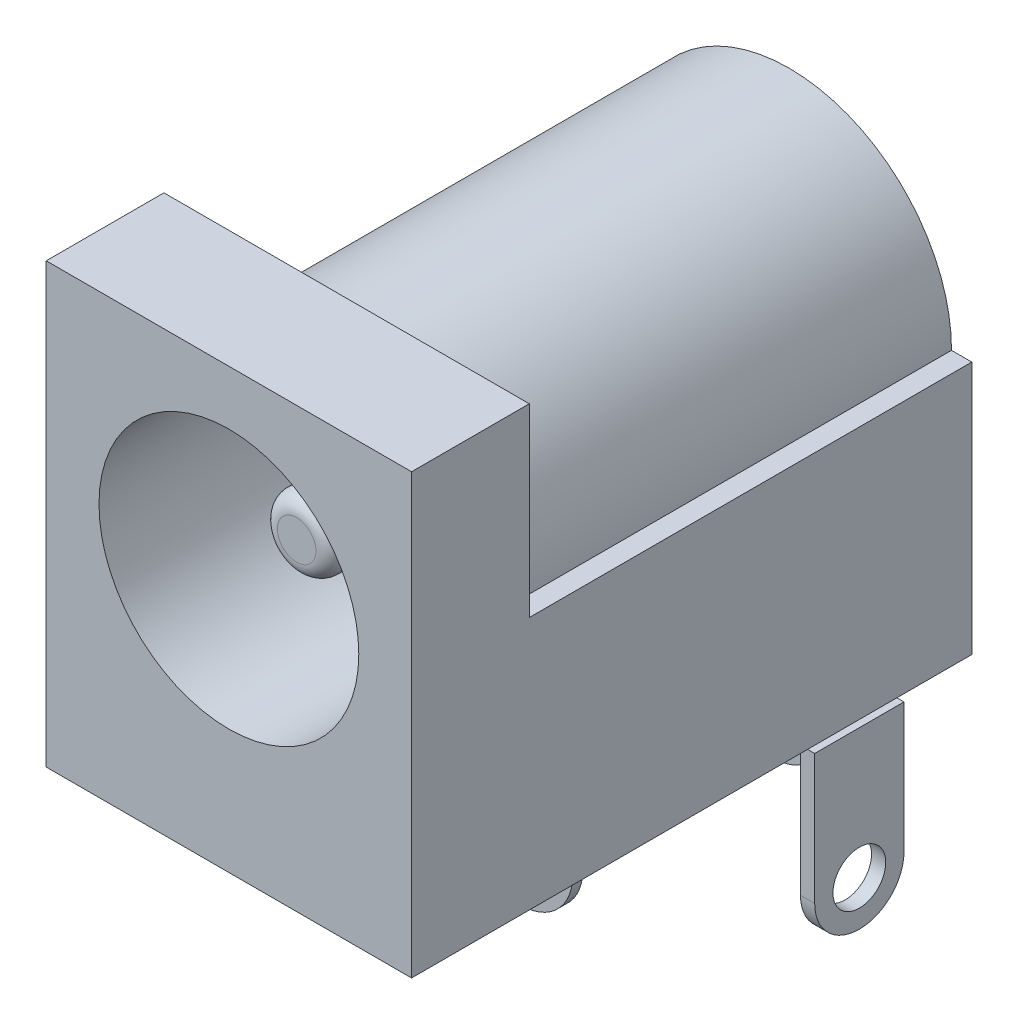
ISO-10303-21;
HEADER;
FILE_DESCRIPTION(('STEP AP214'),'2;1');
FILE_NAME('part.step','',(''),(''),'','','');
FILE_SCHEMA(('AUTOMOTIVE_DESIGN { 1 0 10303 214 1 1 1 1 }'));
ENDSEC;
DATA;
#1=APPLICATION_CONTEXT('core data for automotive mechanical design processes');
#2=APPLICATION_PROTOCOL_DEFINITION('international standard','automotive_design',2000,#1);
#3=PRODUCT_CONTEXT('',#1,'mechanical');
#4=PRODUCT('Part','Part','',(#3));
#5=PRODUCT_RELATED_PRODUCT_CATEGORY('part','',(#4));
#6=PRODUCT_DEFINITION_FORMATION('','',#4);
#7=PRODUCT_DEFINITION_CONTEXT('part definition',#1,'design');
#8=PRODUCT_DEFINITION('design','',#6,#7);
#9=PRODUCT_DEFINITION_SHAPE('','',#8);
#10=(LENGTH_UNIT() NAMED_UNIT(*) SI_UNIT(.MILLI.,.METRE.));
#11=(NAMED_UNIT(*) PLANE_ANGLE_UNIT() SI_UNIT($,.RADIAN.));
#12=(NAMED_UNIT(*) SI_UNIT($,.STERADIAN.) SOLID_ANGLE_UNIT());
#13=UNCERTAINTY_MEASURE_WITH_UNIT(LENGTH_MEASURE(1.E-05),#10,'distance_accuracy_value','');
#14=(GEOMETRIC_REPRESENTATION_CONTEXT(3) GLOBAL_UNCERTAINTY_ASSIGNED_CONTEXT((#13)) GLOBAL_UNIT_ASSIGNED_CONTEXT((#10,
#11,#12)) REPRESENTATION_CONTEXT('',''));
#15=CARTESIAN_POINT('',(0.,0.,0.));
#16=DIRECTION('',(0.,0.,1.));
#17=DIRECTION('',(1.,0.,0.));
#18=AXIS2_PLACEMENT_3D('',#15,#16,#17);
#19=CARTESIAN_POINT('',(5.65,-4.3,-10.905));
#20=DIRECTION('',(-1.,0.,0.));
#21=DIRECTION('',(0.,0.,1.));
#22=AXIS2_PLACEMENT_3D('',#19,#20,#21);
#23=PLANE('',#22);
#24=DIRECTION('',(0.,0.,1.));
#25=VECTOR('',#24,1.);
#26=CARTESIAN_POINT('',(5.65,-3.15,2.901));
#27=LINE('',#26,#25);
#28=CARTESIAN_POINT('',(5.65,-3.15,-10.905));
#29=VERTEX_POINT('',#28);
#30=CARTESIAN_POINT('',(5.65,-3.15,-10.555));
#31=VERTEX_POINT('',#30);
#32=EDGE_CURVE('E203',#29,#31,#27,.T.);
#33=ORIENTED_EDGE('',*,*,#32,.F.);
#34=DIRECTION('',(0.,1.,0.));
#35=VECTOR('',#34,1.);
#36=CARTESIAN_POINT('',(5.65,-4.3,-10.905));
#37=LINE('',#36,#35);
#38=CARTESIAN_POINT('',(5.65,0.,-10.905));
#39=VERTEX_POINT('',#38);
#40=EDGE_CURVE('E448',#29,#39,#37,.T.);
#41=ORIENTED_EDGE('',*,*,#40,.T.);
#42=DIRECTION('',(0.,0.,1.));
#43=VECTOR('',#42,1.);
#44=CARTESIAN_POINT('',(5.65,0.,-10.905));
#45=LINE('',#44,#43);
#46=CARTESIAN_POINT('',(5.65,0.,-10.9));
#47=VERTEX_POINT('',#46);
#48=EDGE_CURVE('E434',#39,#47,#45,.T.);
#49=ORIENTED_EDGE('',*,*,#48,.T.);
#50=CARTESIAN_POINT('',(5.65,0.,-10.555));
#51=VERTEX_POINT('',#50);
#52=EDGE_CURVE('E211',#47,#51,#45,.T.);
#53=ORIENTED_EDGE('',*,*,#52,.T.);
#54=DIRECTION('',(0.,1.,0.));
#55=VECTOR('',#54,1.);
#56=CARTESIAN_POINT('',(5.65,-4.3,-10.555));
#57=LINE('',#56,#55);
#58=EDGE_CURVE('E194',#31,#51,#57,.T.);
#59=ORIENTED_EDGE('',*,*,#58,.F.);
#60=EDGE_LOOP('',(#33,#41,#49,#53,#59));
#61=FACE_BOUND('',#60,.T.);
#62=ADVANCED_FACE('F38',(#61),#23,.F.);
#63=CARTESIAN_POINT('',(3.35,-4.3,-10.555));
#64=DIRECTION('',(0.,0.,-1.));
#65=DIRECTION('',(-1.,0.,0.));
#66=AXIS2_PLACEMENT_3D('',#63,#64,#65);
#67=PLANE('',#66);
#68=CARTESIAN_POINT('',(4.5,-3.15,-10.555));
#69=DIRECTION('',(0.,0.,-1.));
#70=DIRECTION('',(-1.,0.,0.));
#71=AXIS2_PLACEMENT_3D('',#68,#69,#70);
#72=CIRCLE('',#71,0.65);
#73=CARTESIAN_POINT('',(3.85,-3.15,-10.555));
#74=VERTEX_POINT('',#73);
#75=EDGE_CURVE('E479',#74,#74,#72,.F.);
#76=ORIENTED_EDGE('',*,*,#75,.F.);
#77=EDGE_LOOP('',(#76));
#78=FACE_BOUND('',#77,.T.);
#79=CARTESIAN_POINT('',(4.5,-3.15,-10.555));
#80=DIRECTION('',(0.,0.,-1.));
#81=DIRECTION('',(-1.,0.,0.));
#82=AXIS2_PLACEMENT_3D('',#79,#80,#81);
#83=CIRCLE('',#82,1.15);
#84=CARTESIAN_POINT('',(3.35,-3.15,-10.555));
#85=VERTEX_POINT('',#84);
#86=EDGE_CURVE('E189',#31,#85,#83,.T.);
#87=ORIENTED_EDGE('',*,*,#86,.F.);
#88=ORIENTED_EDGE('',*,*,#58,.T.);
#89=DIRECTION('',(-1.,0.,0.));
#90=VECTOR('',#89,1.);
#91=CARTESIAN_POINT('',(3.35,0.,-10.555));
#92=LINE('',#91,#90);
#93=CARTESIAN_POINT('',(3.35,0.,-10.555));
#94=VERTEX_POINT('',#93);
#95=EDGE_CURVE('E433',#51,#94,#92,.T.);
#96=ORIENTED_EDGE('',*,*,#95,.T.);
#97=DIRECTION('',(0.,1.,0.));
#98=VECTOR('',#97,1.);
#99=CARTESIAN_POINT('',(3.35,-4.3,-10.555));
#100=LINE('',#99,#98);
#101=EDGE_CURVE('E196',#85,#94,#100,.T.);
#102=ORIENTED_EDGE('',*,*,#101,.F.);
#103=EDGE_LOOP('',(#87,#88,#96,#102));
#104=FACE_BOUND('',#103,.T.);
#105=ADVANCED_FACE('F191',(#78,#104),#67,.F.);
#106=CARTESIAN_POINT('',(3.35,-4.3,-10.905));
#107=DIRECTION('',(0.,0.,1.));
#108=DIRECTION('',(1.,0.,0.));
#109=AXIS2_PLACEMENT_3D('',#106,#107,#108);
#110=PLANE('',#109);
#111=CARTESIAN_POINT('',(4.5,-3.15,-10.905));
#112=DIRECTION('',(0.,0.,-1.));
#113=DIRECTION('',(-1.,0.,0.));
#114=AXIS2_PLACEMENT_3D('',#111,#112,#113);
#115=CIRCLE('',#114,0.65);
#116=CARTESIAN_POINT('',(3.85,-3.15,-10.905));
#117=VERTEX_POINT('',#116);
#118=EDGE_CURVE('E477',#117,#117,#115,.T.);
#119=ORIENTED_EDGE('',*,*,#118,.F.);
#120=EDGE_LOOP('',(#119));
#121=FACE_BOUND('',#120,.T.);
#122=ORIENTED_EDGE('',*,*,#40,.F.);
#123=CARTESIAN_POINT('',(4.5,-3.15,-10.905));
#124=DIRECTION('',(0.,0.,1.));
#125=DIRECTION('',(-1.,0.,0.));
#126=AXIS2_PLACEMENT_3D('',#123,#124,#125);
#127=CIRCLE('',#126,1.15);
#128=CARTESIAN_POINT('',(3.35,-3.15,-10.905));
#129=VERTEX_POINT('',#128);
#130=EDGE_CURVE('E199',#129,#29,#127,.T.);
#131=ORIENTED_EDGE('',*,*,#130,.F.);
#132=DIRECTION('',(0.,1.,0.));
#133=VECTOR('',#132,1.);
#134=CARTESIAN_POINT('',(3.35,-4.3,-10.905));
#135=LINE('',#134,#133);
#136=CARTESIAN_POINT('',(3.35,0.,-10.905));
#137=VERTEX_POINT('',#136);
#138=EDGE_CURVE('E218',#129,#137,#135,.T.);
#139=ORIENTED_EDGE('',*,*,#138,.T.);
#140=DIRECTION('',(1.,0.,0.));
#141=VECTOR('',#140,1.);
#142=CARTESIAN_POINT('',(3.35,0.,-10.905));
#143=LINE('',#142,#141);
#144=EDGE_CURVE('E445',#137,#39,#143,.T.);
#145=ORIENTED_EDGE('',*,*,#144,.T.);
#146=EDGE_LOOP('',(#122,#131,#139,#145));
#147=FACE_BOUND('',#146,.T.);
#148=ADVANCED_FACE('F339',(#121,#147),#110,.F.);
#149=CARTESIAN_POINT('',(3.23,-4.3,-4.3));
#150=DIRECTION('',(0.,0.,-1.));
#151=DIRECTION('',(-1.,0.,0.));
#152=AXIS2_PLACEMENT_3D('',#149,#150,#151);
#153=PLANE('',#152);
#154=CARTESIAN_POINT('',(4.5,-3.03,-4.3));
#155=DIRECTION('',(0.,0.,1.));
#156=DIRECTION('',(1.,0.,0.));
#157=AXIS2_PLACEMENT_3D('',#154,#155,#156);
#158=CIRCLE('',#157,0.65);
#159=CARTESIAN_POINT('',(5.15,-3.03,-4.3));
#160=VERTEX_POINT('',#159);
#161=EDGE_CURVE('E505',#160,#160,#158,.T.);
#162=ORIENTED_EDGE('',*,*,#161,.F.);
#163=EDGE_LOOP('',(#162));
#164=FACE_BOUND('',#163,.T.);
#165=DIRECTION('',(0.,1.,0.));
#166=VECTOR('',#165,1.);
#167=CARTESIAN_POINT('',(3.23,-4.3,-4.3));
#168=LINE('',#167,#166);
#169=CARTESIAN_POINT('',(3.23,-3.03,-4.3));
#170=VERTEX_POINT('',#169);
#171=CARTESIAN_POINT('',(3.23,0.,-4.3));
#172=VERTEX_POINT('',#171);
#173=EDGE_CURVE('E234',#170,#172,#168,.T.);
#174=ORIENTED_EDGE('',*,*,#173,.F.);
#175=CARTESIAN_POINT('',(4.5,-3.03,-4.3));
#176=DIRECTION('',(0.,0.,-1.));
#177=DIRECTION('',(1.,0.,0.));
#178=AXIS2_PLACEMENT_3D('',#175,#176,#177);
#179=CIRCLE('',#178,1.27);
#180=CARTESIAN_POINT('',(5.77,-3.03,-4.3));
#181=VERTEX_POINT('',#180);
#182=EDGE_CURVE('E503',#181,#170,#179,.T.);
#183=ORIENTED_EDGE('',*,*,#182,.F.);
#184=DIRECTION('',(0.,1.,0.));
#185=VECTOR('',#184,1.);
#186=CARTESIAN_POINT('',(5.77,-4.3,-4.3));
#187=LINE('',#186,#185);
#188=CARTESIAN_POINT('',(5.77,0.,-4.3));
#189=VERTEX_POINT('',#188);
#190=EDGE_CURVE('E236',#181,#189,#187,.T.);
#191=ORIENTED_EDGE('',*,*,#190,.T.);
#192=DIRECTION('',(-1.,0.,0.));
#193=VECTOR('',#192,1.);
#194=CARTESIAN_POINT('',(3.23,0.,-4.3));
#195=LINE('',#194,#193);
#196=EDGE_CURVE('E216',#189,#172,#195,.T.);
#197=ORIENTED_EDGE('',*,*,#196,.T.);
#198=EDGE_LOOP('',(#174,#183,#191,#197));
#199=FACE_BOUND('',#198,.T.);
#200=ADVANCED_FACE('F352',(#164,#199),#153,.F.);
#201=CARTESIAN_POINT('',(3.23,-4.3,-4.55));
#202=DIRECTION('',(1.,0.,0.));
#203=DIRECTION('',(0.,0.,-1.));
#204=AXIS2_PLACEMENT_3D('',#201,#202,#203);
#205=PLANE('',#204);
#206=DIRECTION('',(0.,0.,-1.));
#207=VECTOR('',#206,1.);
#208=CARTESIAN_POINT('',(3.23,-3.03,-10.906));
#209=LINE('',#208,#207);
#210=CARTESIAN_POINT('',(3.23,-3.03,-4.55));
#211=VERTEX_POINT('',#210);
#212=EDGE_CURVE('E497',#170,#211,#209,.T.);
#213=ORIENTED_EDGE('',*,*,#212,.F.);
#214=ORIENTED_EDGE('',*,*,#173,.T.);
#215=DIRECTION('',(0.,0.,-1.));
#216=VECTOR('',#215,1.);
#217=CARTESIAN_POINT('',(3.23,0.,-4.55));
#218=LINE('',#217,#216);
#219=CARTESIAN_POINT('',(3.23,0.,-4.55));
#220=VERTEX_POINT('',#219);
#221=EDGE_CURVE('E224',#172,#220,#218,.T.);
#222=ORIENTED_EDGE('',*,*,#221,.T.);
#223=DIRECTION('',(0.,1.,0.));
#224=VECTOR('',#223,1.);
#225=CARTESIAN_POINT('',(3.23,-4.3,-4.55));
#226=LINE('',#225,#224);
#227=EDGE_CURVE('E232',#211,#220,#226,.T.);
#228=ORIENTED_EDGE('',*,*,#227,.F.);
#229=EDGE_LOOP('',(#213,#214,#222,#228));
#230=FACE_BOUND('',#229,.T.);
#231=ADVANCED_FACE('F348',(#230),#205,.F.);
#232=CARTESIAN_POINT('',(3.23,-4.3,-4.55));
#233=DIRECTION('',(0.,0.,1.));
#234=DIRECTION('',(1.,0.,0.));
#235=AXIS2_PLACEMENT_3D('',#232,#233,#234);
#236=PLANE('',#235);
#237=CARTESIAN_POINT('',(4.5,-3.03,-4.55));
#238=DIRECTION('',(0.,0.,1.));
#239=DIRECTION('',(1.,0.,0.));
#240=AXIS2_PLACEMENT_3D('',#237,#238,#239);
#241=CIRCLE('',#240,0.65);
#242=CARTESIAN_POINT('',(5.15,-3.03,-4.55));
#243=VERTEX_POINT('',#242);
#244=EDGE_CURVE('E507',#243,#243,#241,.F.);
#245=ORIENTED_EDGE('',*,*,#244,.F.);
#246=EDGE_LOOP('',(#245));
#247=FACE_BOUND('',#246,.T.);
#248=CARTESIAN_POINT('',(4.5,-3.03,-4.55));
#249=DIRECTION('',(0.,0.,1.));
#250=DIRECTION('',(1.,0.,0.));
#251=AXIS2_PLACEMENT_3D('',#248,#249,#250);
#252=CIRCLE('',#251,1.27);
#253=CARTESIAN_POINT('',(5.77,-3.03,-4.55));
#254=VERTEX_POINT('',#253);
#255=EDGE_CURVE('E501',#211,#254,#252,.T.);
#256=ORIENTED_EDGE('',*,*,#255,.F.);
#257=ORIENTED_EDGE('',*,*,#227,.T.);
#258=DIRECTION('',(1.,0.,0.));
#259=VECTOR('',#258,1.);
#260=CARTESIAN_POINT('',(3.23,0.,-4.55));
#261=LINE('',#260,#259);
#262=CARTESIAN_POINT('',(5.77,0.,-4.55));
#263=VERTEX_POINT('',#262);
#264=EDGE_CURVE('E227',#220,#263,#261,.T.);
#265=ORIENTED_EDGE('',*,*,#264,.T.);
#266=DIRECTION('',(0.,1.,0.));
#267=VECTOR('',#266,1.);
#268=CARTESIAN_POINT('',(5.77,-4.3,-4.55));
#269=LINE('',#268,#267);
#270=EDGE_CURVE('E230',#254,#263,#269,.T.);
#271=ORIENTED_EDGE('',*,*,#270,.F.);
#272=EDGE_LOOP('',(#256,#257,#265,#271));
#273=FACE_BOUND('',#272,.T.);
#274=ADVANCED_FACE('F344',(#247,#273),#236,.F.);
#275=CARTESIAN_POINT('',(0.,0.,2.9));
#276=DIRECTION('',(0.,1.,0.));
#277=DIRECTION('',(0.,0.,1.));
#278=AXIS2_PLACEMENT_3D('',#275,#276,#277);
#279=PLANE('',#278);
#280=DIRECTION('',(0.,0.,1.));
#281=VECTOR('',#280,1.);
#282=CARTESIAN_POINT('',(5.77,0.,-4.55));
#283=LINE('',#282,#281);
#284=EDGE_CURVE('E213',#263,#189,#283,.T.);
#285=ORIENTED_EDGE('',*,*,#284,.F.);
#286=ORIENTED_EDGE('',*,*,#264,.F.);
#287=ORIENTED_EDGE('',*,*,#221,.F.);
#288=ORIENTED_EDGE('',*,*,#196,.F.);
#289=EDGE_LOOP('',(#285,#286,#287,#288));
#290=FACE_BOUND('',#289,.T.);
#291=DIRECTION('',(-1.,0.,0.));
#292=VECTOR('',#291,1.);
#293=CARTESIAN_POINT('',(8.825,0.,-6.855));
#294=LINE('',#293,#292);
#295=CARTESIAN_POINT('',(9.,0.,-6.855));
#296=VERTEX_POINT('',#295);
#297=CARTESIAN_POINT('',(8.825,0.,-6.855));
#298=VERTEX_POINT('',#297);
#299=EDGE_CURVE('E515',#296,#298,#294,.T.);
#300=ORIENTED_EDGE('',*,*,#299,.F.);
#301=DIRECTION('',(0.,0.,-1.));
#302=VECTOR('',#301,1.);
#303=CARTESIAN_POINT('',(9.,0.,2.9));
#304=LINE('',#303,#302);
#305=CARTESIAN_POINT('',(9.,0.,2.9));
#306=VERTEX_POINT('',#305);
#307=EDGE_CURVE('E307',#306,#296,#304,.T.);
#308=ORIENTED_EDGE('',*,*,#307,.F.);
#309=DIRECTION('',(1.,0.,0.));
#310=VECTOR('',#309,1.);
#311=CARTESIAN_POINT('',(0.,0.,2.9));
#312=LINE('',#311,#310);
#313=CARTESIAN_POINT('',(0.,0.,2.9));
#314=VERTEX_POINT('',#313);
#315=EDGE_CURVE('E288',#314,#306,#312,.T.);
#316=ORIENTED_EDGE('',*,*,#315,.F.);
#317=DIRECTION('',(0.,0.,-1.));
#318=VECTOR('',#317,1.);
#319=CARTESIAN_POINT('',(0.,0.,2.9));
#320=LINE('',#319,#318);
#321=CARTESIAN_POINT('',(0.,0.,-10.9));
#322=VERTEX_POINT('',#321);
#323=EDGE_CURVE('E310',#314,#322,#320,.T.);
#324=ORIENTED_EDGE('',*,*,#323,.T.);
#325=DIRECTION('',(-1.,0.,0.));
#326=VECTOR('',#325,1.);
#327=CARTESIAN_POINT('',(9.,0.,-10.9));
#328=LINE('',#327,#326);
#329=CARTESIAN_POINT('',(3.35,0.,-10.9));
#330=VERTEX_POINT('',#329);
#331=EDGE_CURVE('E251',#330,#322,#328,.T.);
#332=ORIENTED_EDGE('',*,*,#331,.F.);
#333=DIRECTION('',(0.,0.,-1.));
#334=VECTOR('',#333,1.);
#335=CARTESIAN_POINT('',(3.35,0.,-10.905));
#336=LINE('',#335,#334);
#337=EDGE_CURVE('E443',#94,#330,#336,.T.);
#338=ORIENTED_EDGE('',*,*,#337,.F.);
#339=ORIENTED_EDGE('',*,*,#95,.F.);
#340=ORIENTED_EDGE('',*,*,#52,.F.);
#341=CARTESIAN_POINT('',(9.,0.,-10.9));
#342=VERTEX_POINT('',#341);
#343=EDGE_CURVE('E253',#342,#47,#328,.T.);
#344=ORIENTED_EDGE('',*,*,#343,.F.);
#345=CARTESIAN_POINT('',(9.,0.,-9.055));
#346=VERTEX_POINT('',#345);
#347=EDGE_CURVE('E306',#346,#342,#304,.T.);
#348=ORIENTED_EDGE('',*,*,#347,.F.);
#349=DIRECTION('',(1.,0.,0.));
#350=VECTOR('',#349,1.);
#351=CARTESIAN_POINT('',(8.825,0.,-9.055));
#352=LINE('',#351,#350);
#353=CARTESIAN_POINT('',(8.825,0.,-9.055));
#354=VERTEX_POINT('',#353);
#355=EDGE_CURVE('E62',#354,#346,#352,.T.);
#356=ORIENTED_EDGE('',*,*,#355,.F.);
#357=DIRECTION('',(0.,0.,-1.));
#358=VECTOR('',#357,1.);
#359=CARTESIAN_POINT('',(8.825,0.,-9.055));
#360=LINE('',#359,#358);
#361=EDGE_CURVE('E519',#298,#354,#360,.T.);
#362=ORIENTED_EDGE('',*,*,#361,.F.);
#363=EDGE_LOOP('',(#300,#308,#316,#324,#332,#338,#339,#340,#344,#348,#356,#362));
#364=FACE_BOUND('',#363,.T.);
#365=ADVANCED_FACE('F347',(#290,#364),#279,.F.);
#366=CARTESIAN_POINT('',(0.,0.,2.9));
#367=DIRECTION('',(1.,0.,0.));
#368=DIRECTION('',(0.,0.,-1.));
#369=AXIS2_PLACEMENT_3D('',#366,#367,#368);
#370=PLANE('',#369);
#371=DIRECTION('',(0.,-1.,0.));
#372=VECTOR('',#371,1.);
#373=CARTESIAN_POINT('',(0.,0.,0.));
#374=LINE('',#373,#372);
#375=CARTESIAN_POINT('',(0.,10.8,0.));
#376=VERTEX_POINT('',#375);
#377=CARTESIAN_POINT('',(0.,6.24,0.));
#378=VERTEX_POINT('',#377);
#379=EDGE_CURVE('E284',#376,#378,#374,.T.);
#380=ORIENTED_EDGE('',*,*,#379,.T.);
#381=DIRECTION('',(0.,0.,1.));
#382=VECTOR('',#381,1.);
#383=CARTESIAN_POINT('',(0.,6.24,-10.9));
#384=LINE('',#383,#382);
#385=CARTESIAN_POINT('',(0.,6.24,-10.9));
#386=VERTEX_POINT('',#385);
#387=EDGE_CURVE('E281',#386,#378,#384,.T.);
#388=ORIENTED_EDGE('',*,*,#387,.F.);
#389=DIRECTION('',(0.,1.,0.));
#390=VECTOR('',#389,1.);
#391=CARTESIAN_POINT('',(0.,0.,-10.9));
#392=LINE('',#391,#390);
#393=EDGE_CURVE('E256',#322,#386,#392,.T.);
#394=ORIENTED_EDGE('',*,*,#393,.F.);
#395=ORIENTED_EDGE('',*,*,#323,.F.);
#396=DIRECTION('',(0.,-1.,0.));
#397=VECTOR('',#396,1.);
#398=CARTESIAN_POINT('',(0.,0.,2.9));
#399=LINE('',#398,#397);
#400=CARTESIAN_POINT('',(0.,10.8,2.9));
#401=VERTEX_POINT('',#400);
#402=EDGE_CURVE('E285',#401,#314,#399,.T.);
#403=ORIENTED_EDGE('',*,*,#402,.F.);
#404=DIRECTION('',(0.,0.,-1.));
#405=VECTOR('',#404,1.);
#406=CARTESIAN_POINT('',(0.,10.8,2.9));
#407=LINE('',#406,#405);
#408=EDGE_CURVE('E295',#401,#376,#407,.T.);
#409=ORIENTED_EDGE('',*,*,#408,.T.);
#410=EDGE_LOOP('',(#380,#388,#394,#395,#403,#409));
#411=FACE_BOUND('',#410,.T.);
#412=ADVANCED_FACE('F398',(#411),#370,.F.);
#413=CARTESIAN_POINT('',(9.,0.,2.9));
#414=DIRECTION('',(-1.,0.,0.));
#415=DIRECTION('',(0.,-1.,0.));
#416=AXIS2_PLACEMENT_3D('',#413,#414,#415);
#417=PLANE('',#416);
#418=ORIENTED_EDGE('',*,*,#307,.T.);
#419=EDGE_CURVE('E311',#296,#346,#304,.T.);
#420=ORIENTED_EDGE('',*,*,#419,.T.);
#421=ORIENTED_EDGE('',*,*,#347,.T.);
#422=DIRECTION('',(0.,-1.,0.));
#423=VECTOR('',#422,1.);
#424=CARTESIAN_POINT('',(9.,0.,-10.9));
#425=LINE('',#424,#423);
#426=CARTESIAN_POINT('',(9.,6.24,-10.9));
#427=VERTEX_POINT('',#426);
#428=EDGE_CURVE('E248',#427,#342,#425,.T.);
#429=ORIENTED_EDGE('',*,*,#428,.F.);
#430=DIRECTION('',(0.,0.,1.));
#431=VECTOR('',#430,1.);
#432=CARTESIAN_POINT('',(9.,6.24,-10.9));
#433=LINE('',#432,#431);
#434=CARTESIAN_POINT('',(9.,6.24,0.));
#435=VERTEX_POINT('',#434);
#436=EDGE_CURVE('E265',#427,#435,#433,.T.);
#437=ORIENTED_EDGE('',*,*,#436,.T.);
#438=DIRECTION('',(0.,1.,0.));
#439=VECTOR('',#438,1.);
#440=CARTESIAN_POINT('',(9.,0.,0.));
#441=LINE('',#440,#439);
#442=CARTESIAN_POINT('',(9.,10.8,0.));
#443=VERTEX_POINT('',#442);
#444=EDGE_CURVE('E298',#435,#443,#441,.T.);
#445=ORIENTED_EDGE('',*,*,#444,.T.);
#446=DIRECTION('',(0.,0.,-1.));
#447=VECTOR('',#446,1.);
#448=CARTESIAN_POINT('',(9.,10.8,2.9));
#449=LINE('',#448,#447);
#450=CARTESIAN_POINT('',(9.,10.8,2.9));
#451=VERTEX_POINT('',#450);
#452=EDGE_CURVE('E303',#451,#443,#449,.T.);
#453=ORIENTED_EDGE('',*,*,#452,.F.);
#454=DIRECTION('',(0.,1.,0.));
#455=VECTOR('',#454,1.);
#456=CARTESIAN_POINT('',(9.,0.,2.9));
#457=LINE('',#456,#455);
#458=EDGE_CURVE('E291',#306,#451,#457,.T.);
#459=ORIENTED_EDGE('',*,*,#458,.F.);
#460=EDGE_LOOP('',(#418,#420,#421,#429,#437,#445,#453,#459));
#461=FACE_BOUND('',#460,.T.);
#462=ADVANCED_FACE('F394',(#461),#417,.F.);
#463=CARTESIAN_POINT('',(0.,10.8,2.9));
#464=DIRECTION('',(0.,-1.,0.));
#465=DIRECTION('',(0.,0.,-1.));
#466=AXIS2_PLACEMENT_3D('',#463,#464,#465);
#467=PLANE('',#466);
#468=DIRECTION('',(-1.,0.,0.));
#469=VECTOR('',#468,1.);
#470=CARTESIAN_POINT('',(0.,10.8,0.));
#471=LINE('',#470,#469);
#472=EDGE_CURVE('E289',#443,#376,#471,.T.);
#473=ORIENTED_EDGE('',*,*,#472,.T.);
#474=ORIENTED_EDGE('',*,*,#408,.F.);
#475=DIRECTION('',(-1.,0.,0.));
#476=VECTOR('',#475,1.);
#477=CARTESIAN_POINT('',(0.,10.8,2.9));
#478=LINE('',#477,#476);
#479=EDGE_CURVE('E293',#451,#401,#478,.T.);
#480=ORIENTED_EDGE('',*,*,#479,.F.);
#481=ORIENTED_EDGE('',*,*,#452,.T.);
#482=EDGE_LOOP('',(#473,#474,#480,#481));
#483=FACE_BOUND('',#482,.T.);
#484=ADVANCED_FACE('F387',(#483),#467,.F.);
#485=CARTESIAN_POINT('',(0.,0.,2.9));
#486=DIRECTION('',(0.,0.,-1.));
#487=DIRECTION('',(-1.,0.,0.));
#488=AXIS2_PLACEMENT_3D('',#485,#486,#487);
#489=PLANE('',#488);
#490=CARTESIAN_POINT('',(4.5,6.26,2.9));
#491=DIRECTION('',(0.,0.,1.));
#492=DIRECTION('',(1.,0.,0.));
#493=AXIS2_PLACEMENT_3D('',#490,#491,#492);
#494=CIRCLE('',#493,3.2);
#495=CARTESIAN_POINT('',(7.7,6.26,2.9));
#496=VERTEX_POINT('',#495);
#497=EDGE_CURVE('E241',#496,#496,#494,.T.);
#498=ORIENTED_EDGE('',*,*,#497,.F.);
#499=EDGE_LOOP('',(#498));
#500=FACE_BOUND('',#499,.T.);
#501=ORIENTED_EDGE('',*,*,#402,.T.);
#502=ORIENTED_EDGE('',*,*,#315,.T.);
#503=ORIENTED_EDGE('',*,*,#458,.T.);
#504=ORIENTED_EDGE('',*,*,#479,.T.);
#505=EDGE_LOOP('',(#501,#502,#503,#504));
#506=FACE_BOUND('',#505,.T.);
#507=ADVANCED_FACE('F384',(#500,#506),#489,.F.);
#508=CARTESIAN_POINT('',(0.,0.,0.));
#509=DIRECTION('',(0.,0.,-1.));
#510=DIRECTION('',(-1.,0.,0.));
#511=AXIS2_PLACEMENT_3D('',#508,#509,#510);
#512=PLANE('',#511);
#513=DIRECTION('',(1.,0.,0.));
#514=VECTOR('',#513,1.);
#515=CARTESIAN_POINT('',(9.,6.24,0.));
#516=LINE('',#515,#514);
#517=CARTESIAN_POINT('',(8.4999499996875,6.24,0.));
#518=VERTEX_POINT('',#517);
#519=EDGE_CURVE('E252',#518,#435,#516,.T.);
#520=ORIENTED_EDGE('',*,*,#519,.F.);
#521=CARTESIAN_POINT('',(4.5,6.26,0.));
#522=DIRECTION('',(0.,0.,-1.));
#523=DIRECTION('',(-1.,0.,0.));
#524=AXIS2_PLACEMENT_3D('',#521,#522,#523);
#525=CIRCLE('',#524,4.);
#526=CARTESIAN_POINT('',(0.500050000312502,6.24,0.));
#527=VERTEX_POINT('',#526);
#528=EDGE_CURVE('E268',#527,#518,#525,.T.);
#529=ORIENTED_EDGE('',*,*,#528,.F.);
#530=DIRECTION('',(1.,0.,0.));
#531=VECTOR('',#530,1.);
#532=CARTESIAN_POINT('',(0.500050000312502,6.24,0.));
#533=LINE('',#532,#531);
#534=EDGE_CURVE('E245',#378,#527,#533,.T.);
#535=ORIENTED_EDGE('',*,*,#534,.F.);
#536=ORIENTED_EDGE('',*,*,#379,.F.);
#537=ORIENTED_EDGE('',*,*,#472,.F.);
#538=ORIENTED_EDGE('',*,*,#444,.F.);
#539=EDGE_LOOP('',(#520,#529,#535,#536,#537,#538));
#540=FACE_BOUND('',#539,.T.);
#541=ADVANCED_FACE('F382',(#540),#512,.T.);
#542=CARTESIAN_POINT('',(0.500050000312502,6.24,-10.9));
#543=DIRECTION('',(0.,-1.,0.));
#544=DIRECTION('',(0.,0.,-1.));
#545=AXIS2_PLACEMENT_3D('',#542,#543,#544);
#546=PLANE('',#545);
#547=ORIENTED_EDGE('',*,*,#534,.T.);
#548=DIRECTION('',(0.,0.,1.));
#549=VECTOR('',#548,1.);
#550=CARTESIAN_POINT('',(0.500050000312502,6.24,-10.9));
#551=LINE('',#550,#549);
#552=CARTESIAN_POINT('',(0.500050000312502,6.24,-10.9));
#553=VERTEX_POINT('',#552);
#554=EDGE_CURVE('E278',#553,#527,#551,.T.);
#555=ORIENTED_EDGE('',*,*,#554,.F.);
#556=DIRECTION('',(1.,0.,0.));
#557=VECTOR('',#556,1.);
#558=CARTESIAN_POINT('',(0.500050000312502,6.24,-10.9));
#559=LINE('',#558,#557);
#560=EDGE_CURVE('E259',#386,#553,#559,.T.);
#561=ORIENTED_EDGE('',*,*,#560,.F.);
#562=ORIENTED_EDGE('',*,*,#387,.T.);
#563=EDGE_LOOP('',(#547,#555,#561,#562));
#564=FACE_BOUND('',#563,.T.);
#565=ADVANCED_FACE('F378',(#564),#546,.F.);
#566=CARTESIAN_POINT('',(4.5,6.26,-10.9));
#567=DIRECTION('',(0.,0.,1.));
#568=DIRECTION('',(1.,0.,0.));
#569=AXIS2_PLACEMENT_3D('',#566,#567,#568);
#570=CYLINDRICAL_SURFACE('',#569,4.);
#571=ORIENTED_EDGE('',*,*,#528,.T.);
#572=DIRECTION('',(0.,0.,1.));
#573=VECTOR('',#572,1.);
#574=CARTESIAN_POINT('',(8.4999499996875,6.24,-10.9));
#575=LINE('',#574,#573);
#576=CARTESIAN_POINT('',(8.4999499996875,6.24,-10.9));
#577=VERTEX_POINT('',#576);
#578=EDGE_CURVE('E275',#577,#518,#575,.T.);
#579=ORIENTED_EDGE('',*,*,#578,.F.);
#580=CARTESIAN_POINT('',(4.5,6.26,-10.9));
#581=DIRECTION('',(0.,0.,-1.));
#582=DIRECTION('',(-1.,0.,0.));
#583=AXIS2_PLACEMENT_3D('',#580,#581,#582);
#584=CIRCLE('',#583,4.);
#585=EDGE_CURVE('E261',#553,#577,#584,.T.);
#586=ORIENTED_EDGE('',*,*,#585,.F.);
#587=ORIENTED_EDGE('',*,*,#554,.T.);
#588=EDGE_LOOP('',(#571,#579,#586,#587));
#589=FACE_BOUND('',#588,.T.);
#590=ADVANCED_FACE('F374',(#589),#570,.T.);
#591=CARTESIAN_POINT('',(9.,6.24,-10.9));
#592=DIRECTION('',(0.,-1.,0.));
#593=DIRECTION('',(0.,0.,-1.));
#594=AXIS2_PLACEMENT_3D('',#591,#592,#593);
#595=PLANE('',#594);
#596=ORIENTED_EDGE('',*,*,#519,.T.);
#597=ORIENTED_EDGE('',*,*,#436,.F.);
#598=DIRECTION('',(1.,0.,0.));
#599=VECTOR('',#598,1.);
#600=CARTESIAN_POINT('',(9.,6.24,-10.9));
#601=LINE('',#600,#599);
#602=EDGE_CURVE('E263',#577,#427,#601,.T.);
#603=ORIENTED_EDGE('',*,*,#602,.F.);
#604=ORIENTED_EDGE('',*,*,#578,.T.);
#605=EDGE_LOOP('',(#596,#597,#603,#604));
#606=FACE_BOUND('',#605,.T.);
#607=ADVANCED_FACE('F370',(#606),#595,.F.);
#608=CARTESIAN_POINT('',(4.5,6.26,-10.9));
#609=DIRECTION('',(0.,0.,-1.));
#610=DIRECTION('',(-1.,0.,0.));
#611=AXIS2_PLACEMENT_3D('',#608,#609,#610);
#612=PLANE('',#611);
#613=ORIENTED_EDGE('',*,*,#428,.T.);
#614=ORIENTED_EDGE('',*,*,#343,.T.);
#615=EDGE_CURVE('E257',#47,#330,#328,.T.);
#616=ORIENTED_EDGE('',*,*,#615,.T.);
#617=ORIENTED_EDGE('',*,*,#331,.T.);
#618=ORIENTED_EDGE('',*,*,#393,.T.);
#619=ORIENTED_EDGE('',*,*,#560,.T.);
#620=ORIENTED_EDGE('',*,*,#585,.T.);
#621=ORIENTED_EDGE('',*,*,#602,.T.);
#622=EDGE_LOOP('',(#613,#614,#616,#617,#618,#619,#620,#621));
#623=FACE_BOUND('',#622,.T.);
#624=ADVANCED_FACE('F366',(#623),#612,.T.);
#625=CARTESIAN_POINT('',(4.5,6.26,-6.64));
#626=DIRECTION('',(0.,0.,1.));
#627=DIRECTION('',(1.,0.,0.));
#628=AXIS2_PLACEMENT_3D('',#625,#626,#627);
#629=CYLINDRICAL_SURFACE('',#628,3.2);
#630=CARTESIAN_POINT('',(4.5,6.26,-6.64));
#631=DIRECTION('',(0.,0.,1.));
#632=DIRECTION('',(1.,0.,0.));
#633=AXIS2_PLACEMENT_3D('',#630,#631,#632);
#634=CIRCLE('',#633,3.2);
#635=CARTESIAN_POINT('',(7.7,6.26,-6.64));
#636=VERTEX_POINT('',#635);
#637=EDGE_CURVE('E242',#636,#636,#634,.T.);
#638=ORIENTED_EDGE('',*,*,#637,.F.);
#639=EDGE_LOOP('',(#638));
#640=FACE_BOUND('',#639,.T.);
#641=ORIENTED_EDGE('',*,*,#497,.T.);
#642=EDGE_LOOP('',(#641));
#643=FACE_BOUND('',#642,.T.);
#644=ADVANCED_FACE('F362',(#640,#643),#629,.F.);
#645=CARTESIAN_POINT('',(4.5,6.26,-6.64));
#646=DIRECTION('',(0.,0.,1.));
#647=DIRECTION('',(1.,0.,0.));
#648=AXIS2_PLACEMENT_3D('',#645,#646,#647);
#649=PLANE('',#648);
#650=CARTESIAN_POINT('',(4.5,6.26,-6.64));
#651=DIRECTION('',(0.,0.,1.));
#652=DIRECTION('',(1.,0.,0.));
#653=AXIS2_PLACEMENT_3D('',#650,#651,#652);
#654=CIRCLE('',#653,0.875);
#655=CARTESIAN_POINT('',(5.375,6.26,-6.64));
#656=VERTEX_POINT('',#655);
#657=EDGE_CURVE('E238',#656,#656,#654,.T.);
#658=ORIENTED_EDGE('',*,*,#657,.F.);
#659=EDGE_LOOP('',(#658));
#660=FACE_BOUND('',#659,.T.);
#661=ORIENTED_EDGE('',*,*,#637,.T.);
#662=EDGE_LOOP('',(#661));
#663=FACE_BOUND('',#662,.T.);
#664=ADVANCED_FACE('F359',(#660,#663),#649,.T.);
#665=CARTESIAN_POINT('',(4.5,6.26,5.37487373415292));
#666=DIRECTION('',(0.,0.,-1.));
#667=DIRECTION('',(-1.,0.,0.));
#668=AXIS2_PLACEMENT_3D('',#665,#666,#667);
#669=CYLINDRICAL_SURFACE('',#668,0.875);
#670=CARTESIAN_POINT('',(4.5,6.26,0.83));
#671=DIRECTION('',(0.,0.,-1.));
#672=DIRECTION('',(-1.,0.,0.));
#673=AXIS2_PLACEMENT_3D('',#670,#671,#672);
#674=CIRCLE('',#673,0.875);
#675=CARTESIAN_POINT('',(3.625,6.26,0.83));
#676=VERTEX_POINT('',#675);
#677=EDGE_CURVE('E47',#676,#676,#674,.T.);
#678=ORIENTED_EDGE('',*,*,#677,.T.);
#679=EDGE_LOOP('',(#678));
#680=FACE_BOUND('',#679,.T.);
#681=ORIENTED_EDGE('',*,*,#657,.T.);
#682=EDGE_LOOP('',(#681));
#683=FACE_BOUND('',#682,.T.);
#684=ADVANCED_FACE('F317',(#680,#683),#669,.T.);
#685=CARTESIAN_POINT('',(0.,0.,1.23));
#686=DIRECTION('',(0.,0.,-1.));
#687=DIRECTION('',(-1.,0.,0.));
#688=AXIS2_PLACEMENT_3D('',#685,#686,#687);
#689=PLANE('',#688);
#690=CARTESIAN_POINT('',(4.5,6.26,1.23));
#691=DIRECTION('',(0.,0.,-1.));
#692=DIRECTION('',(-1.,0.,0.));
#693=AXIS2_PLACEMENT_3D('',#690,#691,#692);
#694=CIRCLE('',#693,0.475);
#695=CARTESIAN_POINT('',(4.025,6.26,1.23));
#696=VERTEX_POINT('',#695);
#697=EDGE_CURVE('E12',#696,#696,#694,.F.);
#698=ORIENTED_EDGE('',*,*,#697,.T.);
#699=EDGE_LOOP('',(#698));
#700=FACE_BOUND('',#699,.T.);
#701=ADVANCED_FACE('F322',(#700),#689,.F.);
#702=CARTESIAN_POINT('',(4.5,6.26,0.83));
#703=DIRECTION('',(0.,0.,-1.));
#704=DIRECTION('',(-1.,0.,0.));
#705=AXIS2_PLACEMENT_3D('',#702,#703,#704);
#706=TOROIDAL_SURFACE('',#705,0.475,0.4);
#707=ORIENTED_EDGE('',*,*,#697,.F.);
#708=EDGE_LOOP('',(#707));
#709=FACE_BOUND('',#708,.T.);
#710=ORIENTED_EDGE('',*,*,#677,.F.);
#711=EDGE_LOOP('',(#710));
#712=FACE_BOUND('',#711,.T.);
#713=ADVANCED_FACE('F40',(#709,#712),#706,.T.);
#714=CARTESIAN_POINT('',(5.77,-4.3,-4.55));
#715=DIRECTION('',(-1.,0.,0.));
#716=DIRECTION('',(0.,0.,1.));
#717=AXIS2_PLACEMENT_3D('',#714,#715,#716);
#718=PLANE('',#717);
#719=ORIENTED_EDGE('',*,*,#190,.F.);
#720=DIRECTION('',(0.,0.,1.));
#721=VECTOR('',#720,1.);
#722=CARTESIAN_POINT('',(5.77,-3.03,-10.906));
#723=LINE('',#722,#721);
#724=EDGE_CURVE('E500',#254,#181,#723,.T.);
#725=ORIENTED_EDGE('',*,*,#724,.F.);
#726=ORIENTED_EDGE('',*,*,#270,.T.);
#727=ORIENTED_EDGE('',*,*,#284,.T.);
#728=EDGE_LOOP('',(#719,#725,#726,#727));
#729=FACE_BOUND('',#728,.T.);
#730=ADVANCED_FACE('F321',(#729),#718,.F.);
#731=CARTESIAN_POINT('',(3.35,-4.3,-10.905));
#732=DIRECTION('',(1.,0.,0.));
#733=DIRECTION('',(0.,0.,-1.));
#734=AXIS2_PLACEMENT_3D('',#731,#732,#733);
#735=PLANE('',#734);
#736=ORIENTED_EDGE('',*,*,#138,.F.);
#737=DIRECTION('',(0.,0.,-1.));
#738=VECTOR('',#737,1.);
#739=CARTESIAN_POINT('',(3.35,-3.15,2.901));
#740=LINE('',#739,#738);
#741=EDGE_CURVE('E200',#85,#129,#740,.T.);
#742=ORIENTED_EDGE('',*,*,#741,.F.);
#743=ORIENTED_EDGE('',*,*,#101,.T.);
#744=ORIENTED_EDGE('',*,*,#337,.T.);
#745=EDGE_CURVE('E442',#330,#137,#336,.T.);
#746=ORIENTED_EDGE('',*,*,#745,.T.);
#747=EDGE_LOOP('',(#736,#742,#743,#744,#746));
#748=FACE_BOUND('',#747,.T.);
#749=ADVANCED_FACE('F328',(#748),#735,.F.);
#750=CARTESIAN_POINT('',(0.,0.,0.));
#751=DIRECTION('',(0.,1.,0.));
#752=DIRECTION('',(0.,0.,1.));
#753=AXIS2_PLACEMENT_3D('',#750,#751,#752);
#754=PLANE('',#753);
#755=ORIENTED_EDGE('',*,*,#745,.F.);
#756=ORIENTED_EDGE('',*,*,#615,.F.);
#757=ORIENTED_EDGE('',*,*,#48,.F.);
#758=ORIENTED_EDGE('',*,*,#144,.F.);
#759=EDGE_LOOP('',(#755,#756,#757,#758));
#760=FACE_BOUND('',#759,.T.);
#761=ADVANCED_FACE('F457',(#760),#754,.T.);
#762=CARTESIAN_POINT('',(0.,0.,0.));
#763=DIRECTION('',(0.,1.,0.));
#764=DIRECTION('',(0.,0.,1.));
#765=AXIS2_PLACEMENT_3D('',#762,#763,#764);
#766=PLANE('',#765);
#767=ORIENTED_EDGE('',*,*,#419,.F.);
#768=CARTESIAN_POINT('',(9.175,0.,-6.855));
#769=VERTEX_POINT('',#768);
#770=EDGE_CURVE('E516',#769,#296,#294,.T.);
#771=ORIENTED_EDGE('',*,*,#770,.F.);
#772=DIRECTION('',(0.,0.,1.));
#773=VECTOR('',#772,1.);
#774=CARTESIAN_POINT('',(9.175,0.,-9.055));
#775=LINE('',#774,#773);
#776=CARTESIAN_POINT('',(9.175,0.,-9.055));
#777=VERTEX_POINT('',#776);
#778=EDGE_CURVE('E510',#777,#769,#775,.T.);
#779=ORIENTED_EDGE('',*,*,#778,.F.);
#780=EDGE_CURVE('E522',#346,#777,#352,.T.);
#781=ORIENTED_EDGE('',*,*,#780,.F.);
#782=EDGE_LOOP('',(#767,#771,#779,#781));
#783=FACE_BOUND('',#782,.T.);
#784=ADVANCED_FACE('F459',(#783),#766,.T.);
#785=CARTESIAN_POINT('',(9.175,-4.3,-9.055));
#786=DIRECTION('',(-1.,0.,0.));
#787=DIRECTION('',(0.,0.,1.));
#788=AXIS2_PLACEMENT_3D('',#785,#786,#787);
#789=PLANE('',#788);
#790=CARTESIAN_POINT('',(9.175,-3.2,-7.955));
#791=DIRECTION('',(1.,0.,0.));
#792=DIRECTION('',(0.,0.,-1.));
#793=AXIS2_PLACEMENT_3D('',#790,#791,#792);
#794=CIRCLE('',#793,0.649999999999999);
#795=CARTESIAN_POINT('',(9.175,-3.2,-8.605));
#796=VERTEX_POINT('',#795);
#797=EDGE_CURVE('E491',#796,#796,#794,.T.);
#798=ORIENTED_EDGE('',*,*,#797,.F.);
#799=EDGE_LOOP('',(#798));
#800=FACE_BOUND('',#799,.T.);
#801=DIRECTION('',(0.,1.,0.));
#802=VECTOR('',#801,1.);
#803=CARTESIAN_POINT('',(9.175,-4.3,-6.855));
#804=LINE('',#803,#802);
#805=CARTESIAN_POINT('',(9.175,-3.2,-6.855));
#806=VERTEX_POINT('',#805);
#807=EDGE_CURVE('E435',#806,#769,#804,.T.);
#808=ORIENTED_EDGE('',*,*,#807,.F.);
#809=CARTESIAN_POINT('',(9.175,-3.2,-7.955));
#810=DIRECTION('',(-1.,0.,0.));
#811=DIRECTION('',(0.,0.,-1.));
#812=AXIS2_PLACEMENT_3D('',#809,#810,#811);
#813=CIRCLE('',#812,1.1);
#814=CARTESIAN_POINT('',(9.175,-3.2,-9.055));
#815=VERTEX_POINT('',#814);
#816=EDGE_CURVE('E482',#815,#806,#813,.T.);
#817=ORIENTED_EDGE('',*,*,#816,.F.);
#818=DIRECTION('',(0.,1.,0.));
#819=VECTOR('',#818,1.);
#820=CARTESIAN_POINT('',(9.175,-4.3,-9.055));
#821=LINE('',#820,#819);
#822=EDGE_CURVE('E524',#815,#777,#821,.T.);
#823=ORIENTED_EDGE('',*,*,#822,.T.);
#824=ORIENTED_EDGE('',*,*,#778,.T.);
#825=EDGE_LOOP('',(#808,#817,#823,#824));
#826=FACE_BOUND('',#825,.T.);
#827=ADVANCED_FACE('F465',(#800,#826),#789,.F.);
#828=CARTESIAN_POINT('',(8.825,-4.3,-6.855));
#829=DIRECTION('',(0.,0.,-1.));
#830=DIRECTION('',(-1.,0.,0.));
#831=AXIS2_PLACEMENT_3D('',#828,#829,#830);
#832=PLANE('',#831);
#833=DIRECTION('',(0.,1.,0.));
#834=VECTOR('',#833,1.);
#835=CARTESIAN_POINT('',(8.825,-4.3,-6.855));
#836=LINE('',#835,#834);
#837=CARTESIAN_POINT('',(8.825,-3.2,-6.855));
#838=VERTEX_POINT('',#837);
#839=EDGE_CURVE('E437',#838,#298,#836,.T.);
#840=ORIENTED_EDGE('',*,*,#839,.F.);
#841=DIRECTION('',(1.,0.,0.));
#842=VECTOR('',#841,1.);
#843=CARTESIAN_POINT('',(0.,-3.2,-6.855));
#844=LINE('',#843,#842);
#845=EDGE_CURVE('E488',#838,#806,#844,.T.);
#846=ORIENTED_EDGE('',*,*,#845,.T.);
#847=ORIENTED_EDGE('',*,*,#807,.T.);
#848=ORIENTED_EDGE('',*,*,#770,.T.);
#849=ORIENTED_EDGE('',*,*,#299,.T.);
#850=EDGE_LOOP('',(#840,#846,#847,#848,#849));
#851=FACE_BOUND('',#850,.T.);
#852=ADVANCED_FACE('F534',(#851),#832,.F.);
#853=CARTESIAN_POINT('',(8.825,-4.3,-9.055));
#854=DIRECTION('',(1.,0.,0.));
#855=DIRECTION('',(0.,0.,-1.));
#856=AXIS2_PLACEMENT_3D('',#853,#854,#855);
#857=PLANE('',#856);
#858=CARTESIAN_POINT('',(8.825,-3.2,-7.955));
#859=DIRECTION('',(1.,0.,0.));
#860=DIRECTION('',(0.,0.,-1.));
#861=AXIS2_PLACEMENT_3D('',#858,#859,#860);
#862=CIRCLE('',#861,0.649999999999999);
#863=CARTESIAN_POINT('',(8.825,-3.2,-8.605));
#864=VERTEX_POINT('',#863);
#865=EDGE_CURVE('E42',#864,#864,#862,.T.);
#866=ORIENTED_EDGE('',*,*,#865,.T.);
#867=EDGE_LOOP('',(#866));
#868=FACE_BOUND('',#867,.T.);
#869=DIRECTION('',(0.,1.,0.));
#870=VECTOR('',#869,1.);
#871=CARTESIAN_POINT('',(8.825,-4.3,-9.055));
#872=LINE('',#871,#870);
#873=CARTESIAN_POINT('',(8.825,-3.2,-9.055));
#874=VERTEX_POINT('',#873);
#875=EDGE_CURVE('E526',#874,#354,#872,.T.);
#876=ORIENTED_EDGE('',*,*,#875,.F.);
#877=CARTESIAN_POINT('',(8.825,-3.2,-7.955));
#878=DIRECTION('',(1.,0.,0.));
#879=DIRECTION('',(0.,0.,-1.));
#880=AXIS2_PLACEMENT_3D('',#877,#878,#879);
#881=CIRCLE('',#880,1.1);
#882=EDGE_CURVE('E54',#874,#838,#881,.F.);
#883=ORIENTED_EDGE('',*,*,#882,.T.);
#884=ORIENTED_EDGE('',*,*,#839,.T.);
#885=ORIENTED_EDGE('',*,*,#361,.T.);
#886=EDGE_LOOP('',(#876,#883,#884,#885));
#887=FACE_BOUND('',#886,.T.);
#888=ADVANCED_FACE('F531',(#868,#887),#857,.F.);
#889=CARTESIAN_POINT('',(8.825,-4.3,-9.055));
#890=DIRECTION('',(0.,0.,1.));
#891=DIRECTION('',(1.,0.,0.));
#892=AXIS2_PLACEMENT_3D('',#889,#890,#891);
#893=PLANE('',#892);
#894=ORIENTED_EDGE('',*,*,#822,.F.);
#895=DIRECTION('',(1.,0.,0.));
#896=VECTOR('',#895,1.);
#897=CARTESIAN_POINT('',(0.,-3.2,-9.055));
#898=LINE('',#897,#896);
#899=EDGE_CURVE('E489',#874,#815,#898,.T.);
#900=ORIENTED_EDGE('',*,*,#899,.F.);
#901=ORIENTED_EDGE('',*,*,#875,.T.);
#902=ORIENTED_EDGE('',*,*,#355,.T.);
#903=ORIENTED_EDGE('',*,*,#780,.T.);
#904=EDGE_LOOP('',(#894,#900,#901,#902,#903));
#905=FACE_BOUND('',#904,.T.);
#906=ADVANCED_FACE('F538',(#905),#893,.F.);
#907=CARTESIAN_POINT('',(4.5,-3.03,-10.906));
#908=DIRECTION('',(0.,0.,1.));
#909=DIRECTION('',(1.,0.,0.));
#910=AXIS2_PLACEMENT_3D('',#907,#908,#909);
#911=CYLINDRICAL_SURFACE('',#910,1.27);
#912=ORIENTED_EDGE('',*,*,#255,.T.);
#913=ORIENTED_EDGE('',*,*,#724,.T.);
#914=ORIENTED_EDGE('',*,*,#182,.T.);
#915=ORIENTED_EDGE('',*,*,#212,.T.);
#916=EDGE_LOOP('',(#912,#913,#914,#915));
#917=FACE_BOUND('',#916,.T.);
#918=ADVANCED_FACE('F552',(#917),#911,.T.);
#919=CARTESIAN_POINT('',(4.5,-3.03,-10.906));
#920=DIRECTION('',(0.,0.,1.));
#921=DIRECTION('',(1.,0.,0.));
#922=AXIS2_PLACEMENT_3D('',#919,#920,#921);
#923=CYLINDRICAL_SURFACE('',#922,0.65);
#924=ORIENTED_EDGE('',*,*,#161,.T.);
#925=EDGE_LOOP('',(#924));
#926=FACE_BOUND('',#925,.T.);
#927=ORIENTED_EDGE('',*,*,#244,.T.);
#928=EDGE_LOOP('',(#927));
#929=FACE_BOUND('',#928,.T.);
#930=ADVANCED_FACE('F544',(#926,#929),#923,.F.);
#931=CARTESIAN_POINT('',(0.,-3.2,-7.955));
#932=DIRECTION('',(1.,0.,0.));
#933=DIRECTION('',(0.,0.,-1.));
#934=AXIS2_PLACEMENT_3D('',#931,#932,#933);
#935=CYLINDRICAL_SURFACE('',#934,1.1);
#936=ORIENTED_EDGE('',*,*,#899,.T.);
#937=ORIENTED_EDGE('',*,*,#816,.T.);
#938=ORIENTED_EDGE('',*,*,#845,.F.);
#939=ORIENTED_EDGE('',*,*,#882,.F.);
#940=EDGE_LOOP('',(#936,#937,#938,#939));
#941=FACE_BOUND('',#940,.T.);
#942=ADVANCED_FACE('F541',(#941),#935,.T.);
#943=CARTESIAN_POINT('',(0.,-3.2,-7.955));
#944=DIRECTION('',(1.,0.,0.));
#945=DIRECTION('',(0.,0.,-1.));
#946=AXIS2_PLACEMENT_3D('',#943,#944,#945);
#947=CYLINDRICAL_SURFACE('',#946,0.649999999999999);
#948=ORIENTED_EDGE('',*,*,#797,.T.);
#949=EDGE_LOOP('',(#948));
#950=FACE_BOUND('',#949,.T.);
#951=ORIENTED_EDGE('',*,*,#865,.F.);
#952=EDGE_LOOP('',(#951));
#953=FACE_BOUND('',#952,.T.);
#954=ADVANCED_FACE('F543',(#950,#953),#947,.F.);
#955=CARTESIAN_POINT('',(4.5,-3.15,2.901));
#956=DIRECTION('',(0.,0.,-1.));
#957=DIRECTION('',(-1.,0.,0.));
#958=AXIS2_PLACEMENT_3D('',#955,#956,#957);
#959=CYLINDRICAL_SURFACE('',#958,1.15);
#960=ORIENTED_EDGE('',*,*,#86,.T.);
#961=ORIENTED_EDGE('',*,*,#741,.T.);
#962=ORIENTED_EDGE('',*,*,#130,.T.);
#963=ORIENTED_EDGE('',*,*,#32,.T.);
#964=EDGE_LOOP('',(#960,#961,#962,#963));
#965=FACE_BOUND('',#964,.T.);
#966=ADVANCED_FACE('F204',(#965),#959,.T.);
#967=CARTESIAN_POINT('',(4.5,-3.15,2.901));
#968=DIRECTION('',(0.,0.,-1.));
#969=DIRECTION('',(-1.,0.,0.));
#970=AXIS2_PLACEMENT_3D('',#967,#968,#969);
#971=CYLINDRICAL_SURFACE('',#970,0.65);
#972=ORIENTED_EDGE('',*,*,#118,.T.);
#973=EDGE_LOOP('',(#972));
#974=FACE_BOUND('',#973,.T.);
#975=ORIENTED_EDGE('',*,*,#75,.T.);
#976=EDGE_LOOP('',(#975));
#977=FACE_BOUND('',#976,.T.);
#978=ADVANCED_FACE('F556',(#974,#977),#971,.F.);
#979=CLOSED_SHELL('',(#62,#105,#148,#200,#231,#274,#365,#412,#462,#484,#507,#541,#565,#590,#607,
#624,#644,#664,#684,#701,#713,#730,#749,#761,#784,#827,#852,#888,#906,#918,#930,#942,#954,#966,#978));
#980=MANIFOLD_SOLID_BREP('B2',#979);
#981=ADVANCED_BREP_SHAPE_REPRESENTATION('',(#18,#980),#14);
#982=SHAPE_DEFINITION_REPRESENTATION(#9,#981);
ENDSEC;
END-ISO-10303-21;
